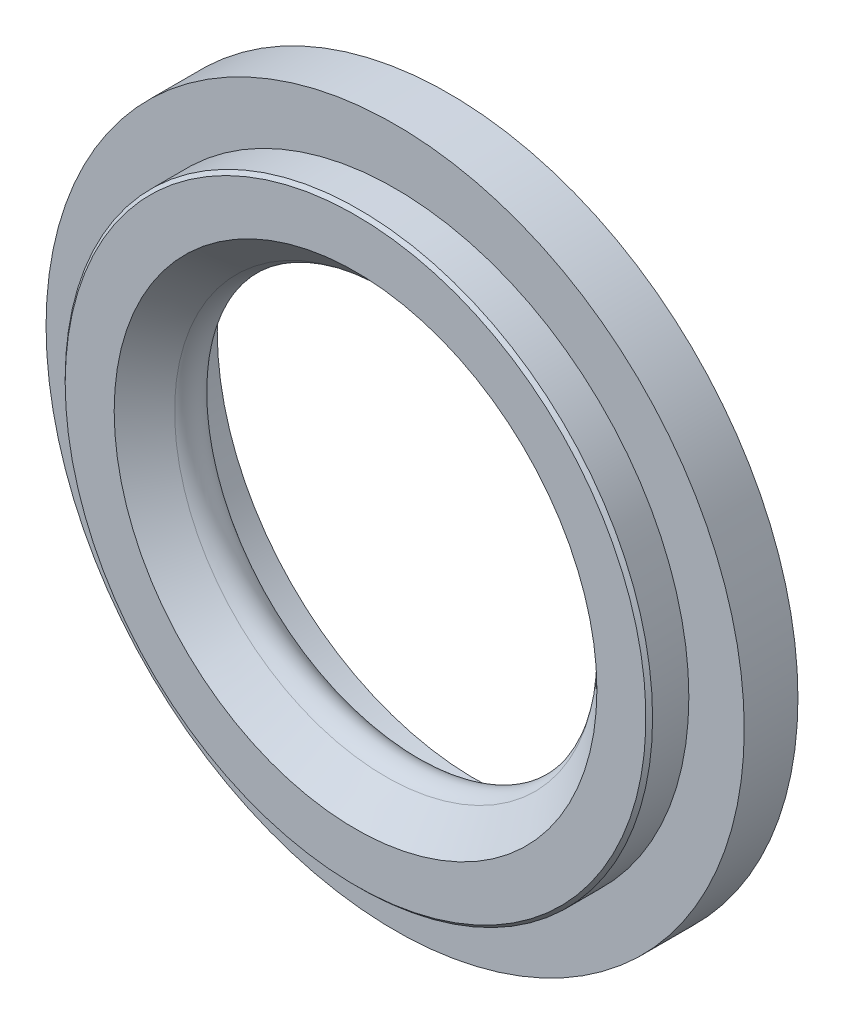
ISO-10303-21;
HEADER;
FILE_DESCRIPTION(('STEP AP214'),'2;1');
FILE_NAME('part.step','',(''),(''),'','','');
FILE_SCHEMA(('AUTOMOTIVE_DESIGN { 1 0 10303 214 1 1 1 1 }'));
ENDSEC;
DATA;
#1=APPLICATION_CONTEXT('core data for automotive mechanical design processes');
#2=APPLICATION_PROTOCOL_DEFINITION('international standard','automotive_design',2000,#1);
#3=PRODUCT_CONTEXT('',#1,'mechanical');
#4=PRODUCT('Part','Part','',(#3));
#5=PRODUCT_RELATED_PRODUCT_CATEGORY('part','',(#4));
#6=PRODUCT_DEFINITION_FORMATION('','',#4);
#7=PRODUCT_DEFINITION_CONTEXT('part definition',#1,'design');
#8=PRODUCT_DEFINITION('design','',#6,#7);
#9=PRODUCT_DEFINITION_SHAPE('','',#8);
#10=(LENGTH_UNIT() NAMED_UNIT(*) SI_UNIT(.MILLI.,.METRE.));
#11=(NAMED_UNIT(*) PLANE_ANGLE_UNIT() SI_UNIT($,.RADIAN.));
#12=(NAMED_UNIT(*) SI_UNIT($,.STERADIAN.) SOLID_ANGLE_UNIT());
#13=UNCERTAINTY_MEASURE_WITH_UNIT(LENGTH_MEASURE(1.E-05),#10,'distance_accuracy_value','');
#14=(GEOMETRIC_REPRESENTATION_CONTEXT(3) GLOBAL_UNCERTAINTY_ASSIGNED_CONTEXT((#13)) GLOBAL_UNIT_ASSIGNED_CONTEXT((#10,
#11,#12)) REPRESENTATION_CONTEXT('',''));
#15=CARTESIAN_POINT('',(0.,0.,0.));
#16=DIRECTION('',(0.,0.,1.));
#17=DIRECTION('',(1.,0.,0.));
#18=AXIS2_PLACEMENT_3D('',#15,#16,#17);
#19=CARTESIAN_POINT('',(-8.636,0.,1.905));
#20=DIRECTION('',(0.,0.,-1.));
#21=DIRECTION('',(-1.,0.,0.));
#22=AXIS2_PLACEMENT_3D('',#19,#20,#21);
#23=PLANE('',#22);
#24=CARTESIAN_POINT('',(0.,0.,1.905));
#25=DIRECTION('',(0.,0.,-1.));
#26=DIRECTION('',(-1.,0.,0.));
#27=AXIS2_PLACEMENT_3D('',#24,#25,#26);
#28=CIRCLE('',#27,8.636);
#29=CARTESIAN_POINT('',(8.636,0.,1.905));
#30=VERTEX_POINT('',#29);
#31=CARTESIAN_POINT('',(-8.636,0.,1.905));
#32=VERTEX_POINT('',#31);
#33=EDGE_CURVE('E36',#30,#32,#28,.F.);
#34=ORIENTED_EDGE('',*,*,#33,.T.);
#35=CARTESIAN_POINT('',(0.,0.,1.905));
#36=DIRECTION('',(0.,0.,-1.));
#37=DIRECTION('',(1.,0.,0.));
#38=AXIS2_PLACEMENT_3D('',#35,#36,#37);
#39=CIRCLE('',#38,8.636);
#40=EDGE_CURVE('E34',#32,#30,#39,.F.);
#41=ORIENTED_EDGE('',*,*,#40,.T.);
#42=EDGE_LOOP('',(#34,#41));
#43=FACE_BOUND('',#42,.T.);
#44=CARTESIAN_POINT('',(0.,0.,1.905));
#45=DIRECTION('',(0.,0.,-1.));
#46=DIRECTION('',(-1.,0.,0.));
#47=AXIS2_PLACEMENT_3D('',#44,#45,#46);
#48=CIRCLE('',#47,9.779);
#49=CARTESIAN_POINT('',(-9.779,0.,1.905));
#50=VERTEX_POINT('',#49);
#51=EDGE_CURVE('E46',#50,#50,#48,.T.);
#52=ORIENTED_EDGE('',*,*,#51,.T.);
#53=EDGE_LOOP('',(#52));
#54=FACE_BOUND('',#53,.T.);
#55=ADVANCED_FACE('F17',(#43,#54),#23,.T.);
#56=CARTESIAN_POINT('',(0.,0.,2.794));
#57=DIRECTION('',(0.,0.,-1.));
#58=DIRECTION('',(-1.,0.,0.));
#59=AXIS2_PLACEMENT_3D('',#56,#57,#58);
#60=TOROIDAL_SURFACE('',#59,8.636,0.889);
#61=ORIENTED_EDGE('',*,*,#40,.F.);
#62=ORIENTED_EDGE('',*,*,#33,.F.);
#63=EDGE_LOOP('',(#61,#62));
#64=FACE_BOUND('',#63,.T.);
#65=CARTESIAN_POINT('',(0.,0.,3.4036));
#66=DIRECTION('',(0.,0.,1.));
#67=DIRECTION('',(1.,0.,0.));
#68=AXIS2_PLACEMENT_3D('',#65,#66,#67);
#69=CIRCLE('',#68,7.98892284849486);
#70=CARTESIAN_POINT('',(7.98892284849486,0.,3.4036));
#71=VERTEX_POINT('',#70);
#72=EDGE_CURVE('E79',#71,#71,#69,.T.);
#73=ORIENTED_EDGE('',*,*,#72,.T.);
#74=EDGE_LOOP('',(#73));
#75=FACE_BOUND('',#74,.T.);
#76=ADVANCED_FACE('F38',(#64,#75),#60,.T.);
#77=CARTESIAN_POINT('',(0.,0.,0.));
#78=DIRECTION('',(0.,0.,-1.));
#79=DIRECTION('',(-1.,0.,0.));
#80=AXIS2_PLACEMENT_3D('',#77,#78,#79);
#81=CYLINDRICAL_SURFACE('',#80,9.779);
#82=CARTESIAN_POINT('',(0.,0.,0.));
#83=DIRECTION('',(0.,0.,-1.));
#84=DIRECTION('',(-1.,0.,0.));
#85=AXIS2_PLACEMENT_3D('',#82,#83,#84);
#86=CIRCLE('',#85,9.779);
#87=CARTESIAN_POINT('',(-9.779,0.,0.));
#88=VERTEX_POINT('',#87);
#89=EDGE_CURVE('E77',#88,#88,#86,.F.);
#90=ORIENTED_EDGE('',*,*,#89,.F.);
#91=EDGE_LOOP('',(#90));
#92=FACE_BOUND('',#91,.T.);
#93=ORIENTED_EDGE('',*,*,#51,.F.);
#94=EDGE_LOOP('',(#93));
#95=FACE_BOUND('',#94,.T.);
#96=ADVANCED_FACE('F91',(#92,#95),#81,.F.);
#97=CARTESIAN_POINT('',(0.,0.,4.5466));
#98=DIRECTION('',(0.,0.,1.));
#99=DIRECTION('',(1.,0.,0.));
#100=AXIS2_PLACEMENT_3D('',#97,#98,#99);
#101=CONICAL_SURFACE('',#100,9.13192284849486,0.785398163397445);
#102=ORIENTED_EDGE('',*,*,#72,.F.);
#103=EDGE_LOOP('',(#102));
#104=FACE_BOUND('',#103,.T.);
#105=CARTESIAN_POINT('',(0.,0.,4.5466));
#106=DIRECTION('',(0.,0.,1.));
#107=DIRECTION('',(1.,0.,0.));
#108=AXIS2_PLACEMENT_3D('',#105,#106,#107);
#109=CIRCLE('',#108,9.13192284849486);
#110=CARTESIAN_POINT('',(9.13192284849486,0.,4.5466));
#111=VERTEX_POINT('',#110);
#112=EDGE_CURVE('E74',#111,#111,#109,.F.);
#113=ORIENTED_EDGE('',*,*,#112,.F.);
#114=EDGE_LOOP('',(#113));
#115=FACE_BOUND('',#114,.T.);
#116=ADVANCED_FACE('F102',(#104,#115),#101,.F.);
#117=CARTESIAN_POINT('',(-9.779,0.,0.));
#118=DIRECTION('',(0.,0.,-1.));
#119=DIRECTION('',(-1.,0.,0.));
#120=AXIS2_PLACEMENT_3D('',#117,#118,#119);
#121=PLANE('',#120);
#122=ORIENTED_EDGE('',*,*,#89,.T.);
#123=EDGE_LOOP('',(#122));
#124=FACE_BOUND('',#123,.T.);
#125=CARTESIAN_POINT('',(0.,0.,0.));
#126=DIRECTION('',(0.,0.,-1.));
#127=DIRECTION('',(-1.,0.,0.));
#128=AXIS2_PLACEMENT_3D('',#125,#126,#127);
#129=CIRCLE('',#128,11.1506);
#130=CARTESIAN_POINT('',(-11.1506,0.,0.));
#131=VERTEX_POINT('',#130);
#132=EDGE_CURVE('E71',#131,#131,#129,.F.);
#133=ORIENTED_EDGE('',*,*,#132,.F.);
#134=EDGE_LOOP('',(#133));
#135=FACE_BOUND('',#134,.T.);
#136=ADVANCED_FACE('F106',(#124,#135),#121,.T.);
#137=CARTESIAN_POINT('',(-11.1125,0.,4.5466));
#138=DIRECTION('',(0.,0.,1.));
#139=DIRECTION('',(1.,0.,0.));
#140=AXIS2_PLACEMENT_3D('',#137,#138,#139);
#141=PLANE('',#140);
#142=ORIENTED_EDGE('',*,*,#112,.T.);
#143=EDGE_LOOP('',(#142));
#144=FACE_BOUND('',#143,.T.);
#145=CARTESIAN_POINT('',(0.,0.,4.5466));
#146=DIRECTION('',(0.,0.,-1.));
#147=DIRECTION('',(-1.,0.,0.));
#148=AXIS2_PLACEMENT_3D('',#145,#146,#147);
#149=CIRCLE('',#148,10.9855);
#150=CARTESIAN_POINT('',(-10.9855,0.,4.5466));
#151=VERTEX_POINT('',#150);
#152=EDGE_CURVE('E68',#151,#151,#149,.T.);
#153=ORIENTED_EDGE('',*,*,#152,.F.);
#154=EDGE_LOOP('',(#153));
#155=FACE_BOUND('',#154,.T.);
#156=ADVANCED_FACE('F110',(#144,#155),#141,.T.);
#157=CARTESIAN_POINT('',(0.,0.,0.));
#158=DIRECTION('',(0.,0.,-1.));
#159=DIRECTION('',(-1.,0.,0.));
#160=AXIS2_PLACEMENT_3D('',#157,#158,#159);
#161=CYLINDRICAL_SURFACE('',#160,11.1506);
#162=CARTESIAN_POINT('',(0.,0.,1.016));
#163=DIRECTION('',(0.,0.,-1.));
#164=DIRECTION('',(-1.,0.,0.));
#165=AXIS2_PLACEMENT_3D('',#162,#163,#164);
#166=CIRCLE('',#165,11.1506);
#167=CARTESIAN_POINT('',(-11.1506,0.,1.016));
#168=VERTEX_POINT('',#167);
#169=EDGE_CURVE('E65',#168,#168,#166,.F.);
#170=ORIENTED_EDGE('',*,*,#169,.F.);
#171=EDGE_LOOP('',(#170));
#172=FACE_BOUND('',#171,.T.);
#173=ORIENTED_EDGE('',*,*,#132,.T.);
#174=EDGE_LOOP('',(#173));
#175=FACE_BOUND('',#174,.T.);
#176=ADVANCED_FACE('F114',(#172,#175),#161,.T.);
#177=CARTESIAN_POINT('',(0.,0.,4.4196));
#178=DIRECTION('',(0.,0.,-1.));
#179=DIRECTION('',(-1.,0.,0.));
#180=AXIS2_PLACEMENT_3D('',#177,#178,#179);
#181=CONICAL_SURFACE('',#180,11.1125,0.785398163397448);
#182=ORIENTED_EDGE('',*,*,#152,.T.);
#183=EDGE_LOOP('',(#182));
#184=FACE_BOUND('',#183,.T.);
#185=CARTESIAN_POINT('',(0.,0.,4.4196));
#186=DIRECTION('',(0.,0.,-1.));
#187=DIRECTION('',(-1.,0.,0.));
#188=AXIS2_PLACEMENT_3D('',#185,#186,#187);
#189=CIRCLE('',#188,11.1125);
#190=CARTESIAN_POINT('',(-11.1125,0.,4.4196));
#191=VERTEX_POINT('',#190);
#192=EDGE_CURVE('E64',#191,#191,#189,.T.);
#193=ORIENTED_EDGE('',*,*,#192,.F.);
#194=EDGE_LOOP('',(#193));
#195=FACE_BOUND('',#194,.T.);
#196=ADVANCED_FACE('F118',(#184,#195),#181,.T.);
#197=CARTESIAN_POINT('',(-11.1506,0.,1.016));
#198=DIRECTION('',(0.,0.,-1.));
#199=DIRECTION('',(-1.,0.,0.));
#200=AXIS2_PLACEMENT_3D('',#197,#198,#199);
#201=PLANE('',#200);
#202=ORIENTED_EDGE('',*,*,#169,.T.);
#203=EDGE_LOOP('',(#202));
#204=FACE_BOUND('',#203,.T.);
#205=CARTESIAN_POINT('',(0.,0.,1.016));
#206=DIRECTION('',(0.,0.,-1.));
#207=DIRECTION('',(-1.,0.,0.));
#208=AXIS2_PLACEMENT_3D('',#205,#206,#207);
#209=CIRCLE('',#208,13.208);
#210=CARTESIAN_POINT('',(-13.208,0.,1.016));
#211=VERTEX_POINT('',#210);
#212=EDGE_CURVE('E61',#211,#211,#209,.F.);
#213=ORIENTED_EDGE('',*,*,#212,.F.);
#214=EDGE_LOOP('',(#213));
#215=FACE_BOUND('',#214,.T.);
#216=ADVANCED_FACE('F122',(#204,#215),#201,.T.);
#217=CARTESIAN_POINT('',(0.,0.,0.));
#218=DIRECTION('',(0.,0.,-1.));
#219=DIRECTION('',(-1.,0.,0.));
#220=AXIS2_PLACEMENT_3D('',#217,#218,#219);
#221=CYLINDRICAL_SURFACE('',#220,11.1125);
#222=ORIENTED_EDGE('',*,*,#192,.T.);
#223=EDGE_LOOP('',(#222));
#224=FACE_BOUND('',#223,.T.);
#225=CARTESIAN_POINT('',(0.,0.,3.048));
#226=DIRECTION('',(0.,0.,-1.));
#227=DIRECTION('',(-1.,0.,0.));
#228=AXIS2_PLACEMENT_3D('',#225,#226,#227);
#229=CIRCLE('',#228,11.1125);
#230=CARTESIAN_POINT('',(-11.1125,0.,3.048));
#231=VERTEX_POINT('',#230);
#232=EDGE_CURVE('E27',#231,#231,#229,.T.);
#233=ORIENTED_EDGE('',*,*,#232,.F.);
#234=EDGE_LOOP('',(#233));
#235=FACE_BOUND('',#234,.T.);
#236=ADVANCED_FACE('F126',(#224,#235),#221,.T.);
#237=CARTESIAN_POINT('',(0.,0.,0.));
#238=DIRECTION('',(0.,0.,-1.));
#239=DIRECTION('',(-1.,0.,0.));
#240=AXIS2_PLACEMENT_3D('',#237,#238,#239);
#241=CYLINDRICAL_SURFACE('',#240,13.208);
#242=CARTESIAN_POINT('',(0.,0.,3.048));
#243=DIRECTION('',(0.,0.,-1.));
#244=DIRECTION('',(-1.,0.,0.));
#245=AXIS2_PLACEMENT_3D('',#242,#243,#244);
#246=CIRCLE('',#245,13.208);
#247=CARTESIAN_POINT('',(-13.208,0.,3.048));
#248=VERTEX_POINT('',#247);
#249=EDGE_CURVE('E11',#248,#248,#246,.F.);
#250=ORIENTED_EDGE('',*,*,#249,.F.);
#251=EDGE_LOOP('',(#250));
#252=FACE_BOUND('',#251,.T.);
#253=ORIENTED_EDGE('',*,*,#212,.T.);
#254=EDGE_LOOP('',(#253));
#255=FACE_BOUND('',#254,.T.);
#256=ADVANCED_FACE('F130',(#252,#255),#241,.T.);
#257=CARTESIAN_POINT('',(-13.208,0.,3.048));
#258=DIRECTION('',(0.,0.,1.));
#259=DIRECTION('',(1.,0.,0.));
#260=AXIS2_PLACEMENT_3D('',#257,#258,#259);
#261=PLANE('',#260);
#262=ORIENTED_EDGE('',*,*,#249,.T.);
#263=EDGE_LOOP('',(#262));
#264=FACE_BOUND('',#263,.T.);
#265=ORIENTED_EDGE('',*,*,#232,.T.);
#266=EDGE_LOOP('',(#265));
#267=FACE_BOUND('',#266,.T.);
#268=ADVANCED_FACE('F134',(#264,#267),#261,.T.);
#269=CLOSED_SHELL('',(#55,#76,#96,#116,#136,#156,#176,#196,#216,#236,#256,#268));
#270=MANIFOLD_SOLID_BREP('B1',#269);
#271=ADVANCED_BREP_SHAPE_REPRESENTATION('',(#18,#270),#14);
#272=SHAPE_DEFINITION_REPRESENTATION(#9,#271);
ENDSEC;
END-ISO-10303-21;
